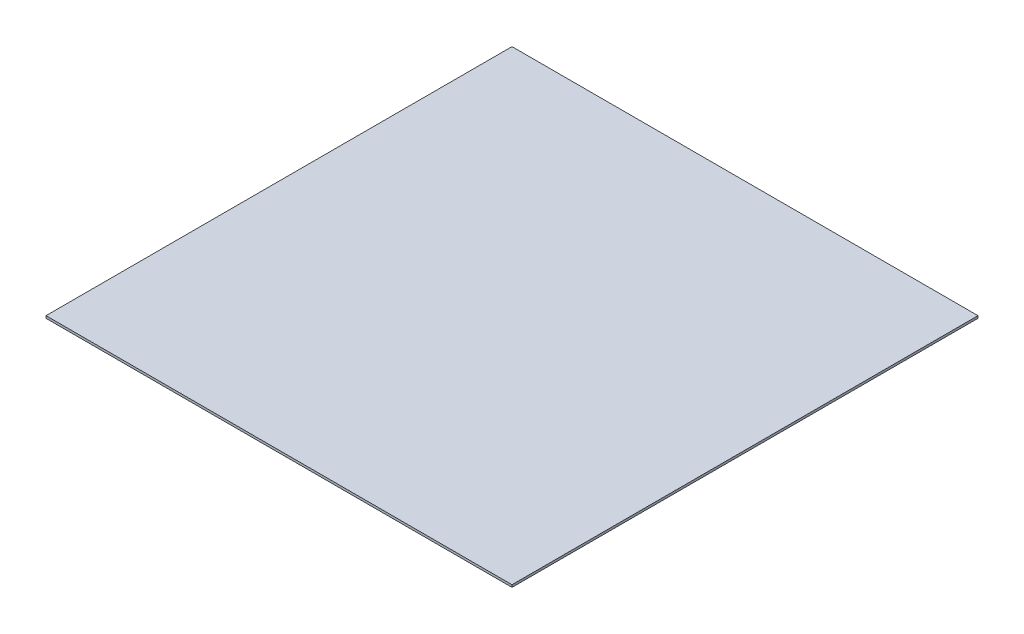
ISO-10303-21;
HEADER;
FILE_DESCRIPTION(('STEP AP214'),'2;1');
FILE_NAME('part.step','',(''),(''),'','','');
FILE_SCHEMA(('AUTOMOTIVE_DESIGN { 1 0 10303 214 1 1 1 1 }'));
ENDSEC;
DATA;
#1=APPLICATION_CONTEXT('core data for automotive mechanical design processes');
#2=APPLICATION_PROTOCOL_DEFINITION('international standard','automotive_design',2000,#1);
#3=PRODUCT_CONTEXT('',#1,'mechanical');
#4=PRODUCT('Part','Part','',(#3));
#5=PRODUCT_RELATED_PRODUCT_CATEGORY('part','',(#4));
#6=PRODUCT_DEFINITION_FORMATION('','',#4);
#7=PRODUCT_DEFINITION_CONTEXT('part definition',#1,'design');
#8=PRODUCT_DEFINITION('design','',#6,#7);
#9=PRODUCT_DEFINITION_SHAPE('','',#8);
#10=(LENGTH_UNIT() NAMED_UNIT(*) SI_UNIT(.MILLI.,.METRE.));
#11=(NAMED_UNIT(*) PLANE_ANGLE_UNIT() SI_UNIT($,.RADIAN.));
#12=(NAMED_UNIT(*) SI_UNIT($,.STERADIAN.) SOLID_ANGLE_UNIT());
#13=UNCERTAINTY_MEASURE_WITH_UNIT(LENGTH_MEASURE(1.E-05),#10,'distance_accuracy_value','');
#14=(GEOMETRIC_REPRESENTATION_CONTEXT(3) GLOBAL_UNCERTAINTY_ASSIGNED_CONTEXT((#13)) GLOBAL_UNIT_ASSIGNED_CONTEXT((#10,
#11,#12)) REPRESENTATION_CONTEXT('',''));
#15=CARTESIAN_POINT('',(0.,0.,0.));
#16=DIRECTION('',(0.,0.,1.));
#17=DIRECTION('',(1.,0.,0.));
#18=AXIS2_PLACEMENT_3D('',#15,#16,#17);
#19=CARTESIAN_POINT('',(-254.,2.54,254.));
#20=DIRECTION('',(-1.,0.,0.));
#21=DIRECTION('',(0.,0.,1.));
#22=AXIS2_PLACEMENT_3D('',#19,#20,#21);
#23=PLANE('',#22);
#24=DIRECTION('',(0.,0.,-1.));
#25=VECTOR('',#24,1.);
#26=CARTESIAN_POINT('',(-254.,0.,254.));
#27=LINE('',#26,#25);
#28=CARTESIAN_POINT('',(-254.,0.,254.));
#29=VERTEX_POINT('',#28);
#30=CARTESIAN_POINT('',(-254.,0.,-254.));
#31=VERTEX_POINT('',#30);
#32=EDGE_CURVE('E98',#29,#31,#27,.T.);
#33=ORIENTED_EDGE('',*,*,#32,.F.);
#34=DIRECTION('',(0.,-1.,0.));
#35=VECTOR('',#34,1.);
#36=CARTESIAN_POINT('',(-254.,2.54,254.));
#37=LINE('',#36,#35);
#38=CARTESIAN_POINT('',(-254.,2.54,254.));
#39=VERTEX_POINT('',#38);
#40=EDGE_CURVE('E11',#39,#29,#37,.T.);
#41=ORIENTED_EDGE('',*,*,#40,.F.);
#42=DIRECTION('',(0.,0.,-1.));
#43=VECTOR('',#42,1.);
#44=CARTESIAN_POINT('',(-254.,2.54,254.));
#45=LINE('',#44,#43);
#46=CARTESIAN_POINT('',(-254.,2.54,-254.));
#47=VERTEX_POINT('',#46);
#48=EDGE_CURVE('E93',#39,#47,#45,.T.);
#49=ORIENTED_EDGE('',*,*,#48,.T.);
#50=DIRECTION('',(0.,-1.,0.));
#51=VECTOR('',#50,1.);
#52=CARTESIAN_POINT('',(-254.,2.54,-254.));
#53=LINE('',#52,#51);
#54=EDGE_CURVE('E36',#47,#31,#53,.T.);
#55=ORIENTED_EDGE('',*,*,#54,.T.);
#56=EDGE_LOOP('',(#33,#41,#49,#55));
#57=FACE_BOUND('',#56,.T.);
#58=ADVANCED_FACE('F33',(#57),#23,.T.);
#59=CARTESIAN_POINT('',(-254.,2.54,254.));
#60=DIRECTION('',(0.,0.,-1.));
#61=DIRECTION('',(-1.,0.,0.));
#62=AXIS2_PLACEMENT_3D('',#59,#60,#61);
#63=PLANE('',#62);
#64=DIRECTION('',(1.,0.,0.));
#65=VECTOR('',#64,1.);
#66=CARTESIAN_POINT('',(-254.,0.,254.));
#67=LINE('',#66,#65);
#68=CARTESIAN_POINT('',(254.,0.,254.));
#69=VERTEX_POINT('',#68);
#70=EDGE_CURVE('E66',#29,#69,#67,.T.);
#71=ORIENTED_EDGE('',*,*,#70,.T.);
#72=DIRECTION('',(0.,-1.,0.));
#73=VECTOR('',#72,1.);
#74=CARTESIAN_POINT('',(254.,2.54,254.));
#75=LINE('',#74,#73);
#76=CARTESIAN_POINT('',(254.,2.54,254.));
#77=VERTEX_POINT('',#76);
#78=EDGE_CURVE('E42',#77,#69,#75,.T.);
#79=ORIENTED_EDGE('',*,*,#78,.F.);
#80=DIRECTION('',(1.,0.,0.));
#81=VECTOR('',#80,1.);
#82=CARTESIAN_POINT('',(-254.,2.54,254.));
#83=LINE('',#82,#81);
#84=EDGE_CURVE('E83',#39,#77,#83,.T.);
#85=ORIENTED_EDGE('',*,*,#84,.F.);
#86=ORIENTED_EDGE('',*,*,#40,.T.);
#87=EDGE_LOOP('',(#71,#79,#85,#86));
#88=FACE_BOUND('',#87,.T.);
#89=ADVANCED_FACE('F108',(#88),#63,.F.);
#90=CARTESIAN_POINT('',(254.,2.54,254.));
#91=DIRECTION('',(-1.,0.,0.));
#92=DIRECTION('',(0.,0.,1.));
#93=AXIS2_PLACEMENT_3D('',#90,#91,#92);
#94=PLANE('',#93);
#95=DIRECTION('',(0.,0.,-1.));
#96=VECTOR('',#95,1.);
#97=CARTESIAN_POINT('',(254.,0.,254.));
#98=LINE('',#97,#96);
#99=CARTESIAN_POINT('',(254.,0.,-254.));
#100=VERTEX_POINT('',#99);
#101=EDGE_CURVE('E90',#69,#100,#98,.T.);
#102=ORIENTED_EDGE('',*,*,#101,.T.);
#103=DIRECTION('',(0.,-1.,0.));
#104=VECTOR('',#103,1.);
#105=CARTESIAN_POINT('',(254.,2.54,-254.));
#106=LINE('',#105,#104);
#107=CARTESIAN_POINT('',(254.,2.54,-254.));
#108=VERTEX_POINT('',#107);
#109=EDGE_CURVE('E87',#108,#100,#106,.T.);
#110=ORIENTED_EDGE('',*,*,#109,.F.);
#111=DIRECTION('',(0.,0.,-1.));
#112=VECTOR('',#111,1.);
#113=CARTESIAN_POINT('',(254.,2.54,254.));
#114=LINE('',#113,#112);
#115=EDGE_CURVE('E78',#77,#108,#114,.T.);
#116=ORIENTED_EDGE('',*,*,#115,.F.);
#117=ORIENTED_EDGE('',*,*,#78,.T.);
#118=EDGE_LOOP('',(#102,#110,#116,#117));
#119=FACE_BOUND('',#118,.T.);
#120=ADVANCED_FACE('F88',(#119),#94,.F.);
#121=CARTESIAN_POINT('',(-254.,2.54,-254.));
#122=DIRECTION('',(0.,0.,-1.));
#123=DIRECTION('',(-1.,0.,0.));
#124=AXIS2_PLACEMENT_3D('',#121,#122,#123);
#125=PLANE('',#124);
#126=DIRECTION('',(1.,0.,0.));
#127=VECTOR('',#126,1.);
#128=CARTESIAN_POINT('',(-254.,0.,-254.));
#129=LINE('',#128,#127);
#130=EDGE_CURVE('E101',#31,#100,#129,.T.);
#131=ORIENTED_EDGE('',*,*,#130,.F.);
#132=ORIENTED_EDGE('',*,*,#54,.F.);
#133=DIRECTION('',(1.,0.,0.));
#134=VECTOR('',#133,1.);
#135=CARTESIAN_POINT('',(-254.,2.54,-254.));
#136=LINE('',#135,#134);
#137=EDGE_CURVE('E82',#47,#108,#136,.T.);
#138=ORIENTED_EDGE('',*,*,#137,.T.);
#139=ORIENTED_EDGE('',*,*,#109,.T.);
#140=EDGE_LOOP('',(#131,#132,#138,#139));
#141=FACE_BOUND('',#140,.T.);
#142=ADVANCED_FACE('F92',(#141),#125,.T.);
#143=CARTESIAN_POINT('',(0.,2.54,0.));
#144=DIRECTION('',(0.,-1.,0.));
#145=DIRECTION('',(0.,0.,-1.));
#146=AXIS2_PLACEMENT_3D('',#143,#144,#145);
#147=PLANE('',#146);
#148=ORIENTED_EDGE('',*,*,#48,.F.);
#149=ORIENTED_EDGE('',*,*,#84,.T.);
#150=ORIENTED_EDGE('',*,*,#115,.T.);
#151=ORIENTED_EDGE('',*,*,#137,.F.);
#152=EDGE_LOOP('',(#148,#149,#150,#151));
#153=FACE_BOUND('',#152,.T.);
#154=ADVANCED_FACE('F81',(#153),#147,.F.);
#155=CARTESIAN_POINT('',(0.,0.,0.));
#156=DIRECTION('',(0.,-1.,0.));
#157=DIRECTION('',(0.,0.,-1.));
#158=AXIS2_PLACEMENT_3D('',#155,#156,#157);
#159=PLANE('',#158);
#160=ORIENTED_EDGE('',*,*,#32,.T.);
#161=ORIENTED_EDGE('',*,*,#130,.T.);
#162=ORIENTED_EDGE('',*,*,#101,.F.);
#163=ORIENTED_EDGE('',*,*,#70,.F.);
#164=EDGE_LOOP('',(#160,#161,#162,#163));
#165=FACE_BOUND('',#164,.T.);
#166=ADVANCED_FACE('F106',(#165),#159,.T.);
#167=CLOSED_SHELL('',(#58,#89,#120,#142,#154,#166));
#168=MANIFOLD_SOLID_BREP('B2',#167);
#169=ADVANCED_BREP_SHAPE_REPRESENTATION('',(#18,#168),#14);
#170=SHAPE_DEFINITION_REPRESENTATION(#9,#169);
ENDSEC;
END-ISO-10303-21;
